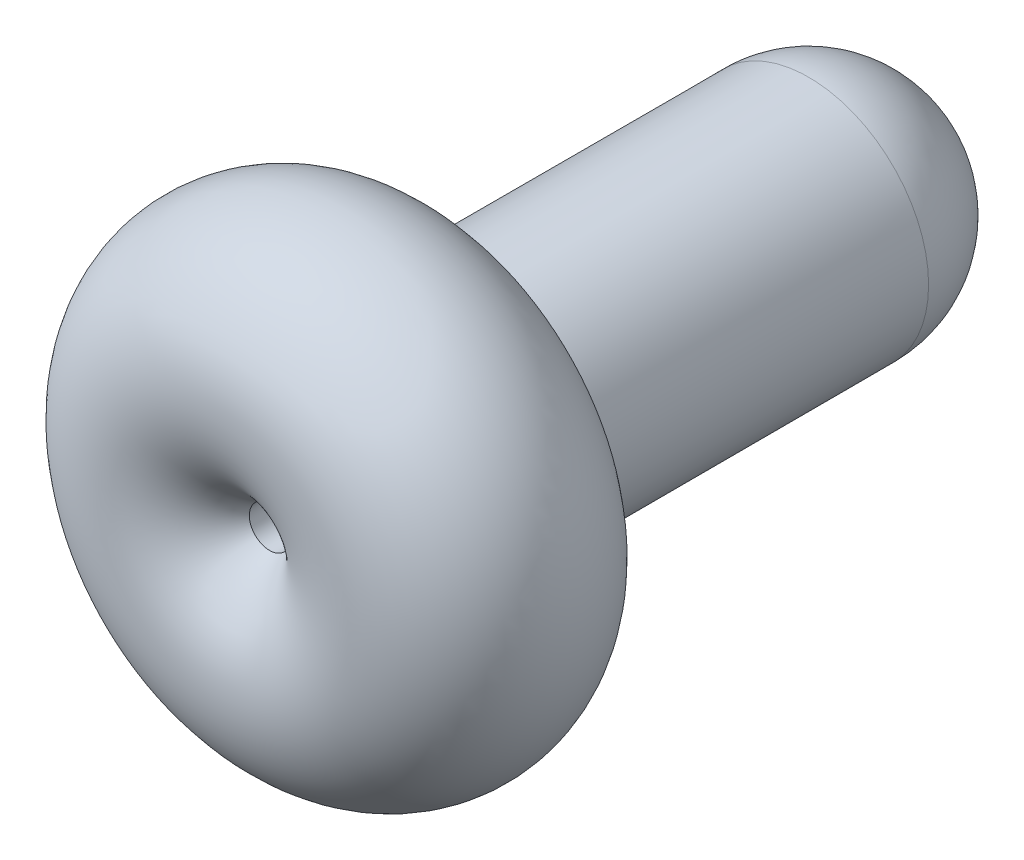
ISO-10303-21;
HEADER;
FILE_DESCRIPTION(('STEP AP214'),'2;1');
FILE_NAME('part.step','',(''),(''),'','','');
FILE_SCHEMA(('AUTOMOTIVE_DESIGN { 1 0 10303 214 1 1 1 1 }'));
ENDSEC;
DATA;
#1=APPLICATION_CONTEXT('core data for automotive mechanical design processes');
#2=APPLICATION_PROTOCOL_DEFINITION('international standard','automotive_design',2000,#1);
#3=PRODUCT_CONTEXT('',#1,'mechanical');
#4=PRODUCT('Part','Part','',(#3));
#5=PRODUCT_RELATED_PRODUCT_CATEGORY('part','',(#4));
#6=PRODUCT_DEFINITION_FORMATION('','',#4);
#7=PRODUCT_DEFINITION_CONTEXT('part definition',#1,'design');
#8=PRODUCT_DEFINITION('design','',#6,#7);
#9=PRODUCT_DEFINITION_SHAPE('','',#8);
#10=(LENGTH_UNIT() NAMED_UNIT(*) SI_UNIT(.MILLI.,.METRE.));
#11=(NAMED_UNIT(*) PLANE_ANGLE_UNIT() SI_UNIT($,.RADIAN.));
#12=(NAMED_UNIT(*) SI_UNIT($,.STERADIAN.) SOLID_ANGLE_UNIT());
#13=UNCERTAINTY_MEASURE_WITH_UNIT(LENGTH_MEASURE(1.E-05),#10,'distance_accuracy_value','');
#14=(GEOMETRIC_REPRESENTATION_CONTEXT(3) GLOBAL_UNCERTAINTY_ASSIGNED_CONTEXT((#13)) GLOBAL_UNIT_ASSIGNED_CONTEXT((#10,
#11,#12)) REPRESENTATION_CONTEXT('',''));
#15=CARTESIAN_POINT('',(0.,0.,0.));
#16=DIRECTION('',(0.,0.,1.));
#17=DIRECTION('',(1.,0.,0.));
#18=AXIS2_PLACEMENT_3D('',#15,#16,#17);
#19=CARTESIAN_POINT('',(-2.14820546420857E-05,0.,-0.0252715767265323));
#20=DIRECTION('',(0.000850047747802191,0.,0.999999638709348));
#21=DIRECTION('',(0.999999638709348,0.,-0.000850047747802191));
#22=AXIS2_PLACEMENT_3D('',#19,#20,#21);
#23=DEGENERATE_TOROIDAL_SURFACE('',#22,29.7295967101522,29.7296074511815,.T.);
#24=CARTESIAN_POINT('',(-0.0252930587811734,0.,-29.7548575458534));
#25=DIRECTION('',(0.000850047747802191,0.,0.999999638709348));
#26=DIRECTION('',(0.999999638709348,0.,-0.000850047747802191));
#27=AXIS2_PLACEMENT_3D('',#24,#25,#26);
#28=CIRCLE('',#27,29.7043251242953);
#29=CARTESIAN_POINT('',(29.6790213336192,0.,-29.7801076405253));
#30=VERTEX_POINT('',#29);
#31=EDGE_CURVE('E11',#30,#30,#28,.T.);
#32=ORIENTED_EDGE('',*,*,#31,.T.);
#33=EDGE_LOOP('',(#32));
#34=FACE_BOUND('',#33,.T.);
#35=CARTESIAN_POINT('',(-3.52937908554141,-3.54167803054972,16.4939822803967));
#36=CARTESIAN_POINT('',(-3.43265624655147,-3.6380668936276,16.4934945608445));
#37=CARTESIAN_POINT('',(-3.33199660969603,-3.73047539620615,16.4929869685404));
#38=CARTESIAN_POINT('',(-3.12342158537705,-3.90677384189353,16.4919351446487));
#39=CARTESIAN_POINT('',(-3.01550453639253,-3.99066182319261,16.4913909046708));
#40=CARTESIAN_POINT('',(-2.79307977069744,-4.14938414489942,16.4902691263667));
#41=CARTESIAN_POINT('',(-2.67856688402947,-4.22421123667159,16.4896915619195));
#42=CARTESIAN_POINT('',(-2.44375426265563,-4.36425929494615,16.4885071819435));
#43=CARTESIAN_POINT('',(-2.32345243820394,-4.42947675743579,16.4879003558515));
#44=CARTESIAN_POINT('',(-2.07447267051277,-4.55151813816418,16.4866443803725));
#45=CARTESIAN_POINT('',(-1.94565457157575,-4.6080563389957,16.4859945219852));
#46=CARTESIAN_POINT('',(-1.68366509587379,-4.71010006421125,16.4846727633293));
#47=CARTESIAN_POINT('',(-1.55049208721205,-4.75560139776745,16.4840008547976));
#48=CARTESIAN_POINT('',(-1.28085436381916,-4.83520030383926,16.4826403444658));
#49=CARTESIAN_POINT('',(-1.14439136414236,-4.86930368589197,16.4819517513625));
#50=CARTESIAN_POINT('',(-0.869027147389787,-4.9259066691826,16.480562173495));
#51=CARTESIAN_POINT('',(-0.730125047777996,-4.94840197694336,16.479861184245));
#52=CARTESIAN_POINT('',(-0.45096142258437,-4.98160480811783,16.4784522544444));
#53=CARTESIAN_POINT('',(-0.310700317770138,-4.99231586942173,16.4777443160445));
#54=CARTESIAN_POINT('',(-0.0297225784775018,-5.00188806359017,16.476326048908));
#55=CARTESIAN_POINT('',(0.110994205085493,-5.00074481926538,16.4756157193852));
#56=CARTESIAN_POINT('',(0.391782313508285,-4.98660797191695,16.4741982269725));
#57=CARTESIAN_POINT('',(0.531853847610922,-4.97361852901479,16.4734910630585));
#58=CARTESIAN_POINT('',(0.810454311570726,-4.93588240751348,16.4720844342613));
#59=CARTESIAN_POINT('',(0.9489826527859,-4.91113138977399,16.4713849723171));
#60=CARTESIAN_POINT('',(1.22341838095097,-4.85005059600272,16.469999195708));
#61=CARTESIAN_POINT('',(1.35932673169215,-4.81372516739331,16.4693128762091));
#62=CARTESIAN_POINT('',(1.6276181288711,-4.72976268692778,16.4679579576815));
#63=CARTESIAN_POINT('',(1.75999985523383,-4.68212146374938,16.4672893652886));
#64=CARTESIAN_POINT('',(2.15031988340826,-4.52271052953501,16.4653179419673));
#65=CARTESIAN_POINT('',(2.40173110409843,-4.39438692988881,16.4640479597478));
#66=CARTESIAN_POINT('',(2.87929972232492,-4.09741578857534,16.4616353113406));
#67=CARTESIAN_POINT('',(3.1054572330219,-3.92876842760752,16.4604926445824));
#68=CARTESIAN_POINT('',(3.52628607759998,-3.55588124102709,16.4583662044062));
#69=CARTESIAN_POINT('',(3.72095746455414,-3.35164147541028,16.4573824307204));
#70=CARTESIAN_POINT('',(4.07323603505961,-2.91338427794481,16.455602058692));
#71=CARTESIAN_POINT('',(4.23084361080811,-2.67936716123078,16.4548054583688));
#72=CARTESIAN_POINT('',(4.50453639709806,-2.1881924036297,16.4534220508267));
#73=CARTESIAN_POINT('',(4.62062157824366,-1.93103474636042,16.4528352437562));
#74=CARTESIAN_POINT('',(4.80796901307307,-1.40088353914708,16.4518881774763));
#75=CARTESIAN_POINT('',(4.87923182620671,-1.12789018690249,16.4515279154392));
#76=CARTESIAN_POINT('',(4.97491465119113,-0.573814018295399,16.451044194652));
#77=CARTESIAN_POINT('',(4.99933467849509,-0.292731204601601,16.4509207358239));
#78=CARTESIAN_POINT('',(5.0006384353805,0.269542376089051,16.4509141445856));
#79=CARTESIAN_POINT('',(4.97752254435202,0.550733142206416,16.4510310102574));
#80=CARTESIAN_POINT('',(4.88441154231587,1.1052427242294,16.4515017298513));
#81=CARTESIAN_POINT('',(4.81441642800171,1.3785615395798,16.4518555837901));
#82=CARTESIAN_POINT('',(4.6295340908725,1.90956841482521,16.4527901908606));
#83=CARTESIAN_POINT('',(4.51464688572011,2.16725648087004,16.4533709439031));
#84=CARTESIAN_POINT('',(4.24324186183084,2.65968713652602,16.4547427924158));
#85=CARTESIAN_POINT('',(4.08672404310146,2.8944297261413,16.455533887886));
#86=CARTESIAN_POINT('',(3.73649969384899,3.33430773514405,16.4573038859838));
#87=CARTESIAN_POINT('',(3.54279288436246,3.5394429324192,16.4582827900203));
#88=CARTESIAN_POINT('',(3.12369018355613,3.91428120422248,16.4604005191516));
#89=CARTESIAN_POINT('',(2.89829428903823,4.08398427517473,16.4615393442626));
#90=CARTESIAN_POINT('',(2.42220884623318,4.3831431236294,16.4639445144287));
#91=CARTESIAN_POINT('',(2.17151899160345,4.51259841360161,16.4652108610283));
#92=CARTESIAN_POINT('',(1.65196421269304,4.72758427866496,16.4678350384164));
#93=CARTESIAN_POINT('',(1.38309928935721,4.81311485603957,16.4691928692003));
#94=CARTESIAN_POINT('',(0.834823561043546,4.93782449510462,16.4719614333928));
#95=CARTESIAN_POINT('',(0.555412637921729,4.97700303736658,16.4733721673941));
#96=CARTESIAN_POINT('',(-0.0060214141050611,5.007894021852,16.4762064546336));
#97=CARTESIAN_POINT('',(-0.288044544088954,4.99960644446967,16.4776300078772));
#98=CARTESIAN_POINT('',(-0.84669647806471,4.93580309981764,16.4804495260134));
#99=CARTESIAN_POINT('',(-1.12332525010208,4.88028705286809,16.4818454907426));
#100=CARTESIAN_POINT('',(-1.66334261361597,4.72359144580923,16.484570273517));
#101=CARTESIAN_POINT('',(-1.926731217943,4.62241193002044,16.4858990916273));
#102=CARTESIAN_POINT('',(-2.43275778555927,4.37730226700009,16.4884517534184));
#103=CARTESIAN_POINT('',(-2.67539580868987,4.23337224305952,16.4896755974018));
#104=CARTESIAN_POINT('',(-3.13315780860542,3.9066956236493,16.4919842769673));
#105=CARTESIAN_POINT('',(-3.34828174083506,3.7239489653227,16.4930691123243));
#106=CARTESIAN_POINT('',(-3.64551141398776,3.42492439332556,16.4945678683024));
#107=CARTESIAN_POINT('',(-3.74038885878674,3.32103700360415,16.4950462572094));
#108=CARTESIAN_POINT('',(-3.92105066228133,3.10565300686295,16.4959571504188));
#109=CARTESIAN_POINT('',(-4.00683836417956,2.99415922244776,16.4963896715913));
#110=CARTESIAN_POINT('',(-4.16873993933254,2.76430579991862,16.4972059119305));
#111=CARTESIAN_POINT('',(-4.24485021225212,2.6459436302417,16.4975896129343));
#112=CARTESIAN_POINT('',(-4.3868031066236,2.40327026778256,16.4983052303677));
#113=CARTESIAN_POINT('',(-4.45264950727546,2.27896128677896,16.4986371658574));
#114=CARTESIAN_POINT('',(-4.57366015769042,2.02519180479443,16.4992471719118));
#115=CARTESIAN_POINT('',(-4.62882040498249,1.89572939541139,16.4995252222939));
#116=CARTESIAN_POINT('',(-4.72801819429053,1.63266562641776,16.500025246259));
#117=CARTESIAN_POINT('',(-4.77205983418588,1.49906581213238,16.5002472405021));
#118=CARTESIAN_POINT('',(-4.84874650555702,1.22858617729012,16.5006337774642));
#119=CARTESIAN_POINT('',(-4.88138773292308,1.09170527814541,16.5007983010064));
#120=CARTESIAN_POINT('',(-4.93501115082378,0.815730948275033,16.5010685800084));
#121=CARTESIAN_POINT('',(-4.95599764052373,0.676638352894748,16.5011743571386));
#122=CARTESIAN_POINT('',(-4.9861849113398,0.397142866337847,16.5013265077917));
#123=CARTESIAN_POINT('',(-4.9953825848703,0.256739639493487,16.5013728656515));
#124=CARTESIAN_POINT('',(-5.0019154223811,-0.024290598061804,16.5014057923516));
#125=CARTESIAN_POINT('',(-4.99925496170459,-0.164917507097559,16.5013923832443));
#126=CARTESIAN_POINT('',(-4.98209525174279,-0.445531445270577,16.5013058949699));
#127=CARTESIAN_POINT('',(-4.96758894432489,-0.585518042870909,16.5012327802282));
#128=CARTESIAN_POINT('',(-4.92683931662349,-0.863719477874172,16.5010273915224));
#129=CARTESIAN_POINT('',(-4.90060032357629,-1.00193494918681,16.5008951393692));
#130=CARTESIAN_POINT('',(-4.83654714593039,-1.27577424411664,16.5005722866788));
#131=CARTESIAN_POINT('',(-4.79872370799512,-1.41139590352458,16.5003816394971));
#132=CARTESIAN_POINT('',(-4.7117945407551,-1.67891842388791,16.4999434690349));
#133=CARTESIAN_POINT('',(-4.66269291883245,-1.81082061984075,16.4996959664603));
#134=CARTESIAN_POINT('',(-4.5535904523955,-2.06991653145777,16.4991460046495));
#135=CARTESIAN_POINT('',(-4.49359833847934,-2.19711392121057,16.4988435894352));
#136=CARTESIAN_POINT('',(-4.36313943666772,-2.44596651967509,16.4981859374553));
#137=CARTESIAN_POINT('',(-4.29267520795588,-2.56762307299736,16.4978307135951));
#138=CARTESIAN_POINT('',(-4.11872069416306,-2.84072654333449,16.4969537424178));
#139=CARTESIAN_POINT('',(-4.01171103415531,-2.98994850281468,16.4964142432811));
#140=CARTESIAN_POINT('',(-3.78195785073142,-3.27572985734785,16.4952558557724));
#141=CARTESIAN_POINT('',(-3.65921535302553,-3.41229007688997,16.4946369725759));
#142=CARTESIAN_POINT('',(-3.52937908554141,-3.54167803054972,16.4939822803967));
#143=B_SPLINE_CURVE_WITH_KNOTS('',3,(#35,#36,#37,#38,#39,#40,#41,#42,#43,#44,#45,#46,#47,#48,
#49,#50,#51,#52,#53,#54,#55,#56,#57,#58,#59,#60,#61,#62,#63,#64,#65,#66,#67,#68,#69,#70,#71,#72,
#73,#74,#75,#76,#77,#78,#79,#80,#81,#82,#83,#84,#85,#86,#87,#88,#89,#90,#91,#92,#93,#94,#95,#96,
#97,#98,#99,#100,#101,#102,#103,#104,#105,#106,#107,#108,#109,#110,#111,#112,#113,#114,#115,
#116,#117,#118,#119,#120,#121,#122,#123,#124,#125,#126,#127,#128,#129,#130,#131,#132,#133,#134,
#135,#136,#137,#138,#139,#140,#141,#142),.UNSPECIFIED.,.T.,.F.,(4,2,2,2,2,2,2,2,2,2,2,2,2,2,2,2,
2,2,2,2,2,2,2,2,2,2,2,2,2,2,2,2,2,2,2,2,2,2,2,2,2,2,2,2,2,2,2,2,2,2,2,2,2,4),(0.,
0.409504181570481,0.819102436821026,1.22902623225574,1.6390991325489,2.0606393536247,
2.48233938877044,2.90382415439579,3.32546470300546,3.74697863126907,4.16864820862913,
4.59016976200887,5.01184694615173,5.43336593199786,5.85504054349197,6.69748503071416,
7.53992574283215,8.38236503491604,9.22479541217998,10.0672263858427,10.9096468445052,
11.7520670252578,12.5944804825761,13.4368939993116,14.2793071846025,15.1217203697417,
15.9641398742692,16.8065594638154,17.6489892573775,18.4914190071448,19.333858197228,
20.1762977352791,21.0187422621644,21.8611859713831,22.703627251047,23.5460698949122,
23.967739107321,24.3892526876911,24.8109226295503,25.2324369421738,25.6541088279455,
26.0756250744862,26.4972818392333,26.9187829609842,27.3403951695139,27.7618518269817,
28.1835597851298,28.6051123375343,29.0270024966266,29.4487392512153,29.8701393926266,
30.2914367207693,30.8411720244532,31.3908715060801),.UNSPECIFIED.);
#144=CARTESIAN_POINT('',(-3.52937908554141,-3.54167803054972,16.4939822803967));
#145=VERTEX_POINT('',#144);
#146=EDGE_CURVE('E43',#145,#145,#143,.T.);
#147=ORIENTED_EDGE('',*,*,#146,.F.);
#148=EDGE_LOOP('',(#147));
#149=FACE_BOUND('',#148,.T.);
#150=ADVANCED_FACE('F39',(#34,#149),#23,.T.);
#151=CARTESIAN_POINT('',(-0.0740599871520978,0.,-116.729686838683));
#152=DIRECTION('',(0.,-1.,0.));
#153=DIRECTION('',(0.999999638709348,0.,-0.000850047747802191));
#154=AXIS2_PLACEMENT_3D('',#151,#152,#153);
#155=CIRCLE('',#154,29.6052157882059);
#156=TRIMMED_CURVE('',#155,(PARAMETER_VALUE(-1.57164637464507)),
(PARAMETER_VALUE(1.57164637464507)),.T.,.PARAMETER.);
#157=CARTESIAN_POINT('',(-0.099225825063873,0.,-116.729665446511));
#158=DIRECTION('',(0.000850047747802191,0.,0.999999638709348));
#159=AXIS1_PLACEMENT('',#157,#158);
#160=SURFACE_OF_REVOLUTION('',#156,#159);
#161=CARTESIAN_POINT('',(-0.0992472172354402,0.,-116.754831284423));
#162=DIRECTION('',(0.000850047747802191,0.,0.999999638709348));
#163=DIRECTION('',(0.999999638709348,0.,-0.000850047747802191));
#164=AXIS2_PLACEMENT_3D('',#161,#162,#163);
#165=CIRCLE('',#164,29.6303709391221);
#166=CARTESIAN_POINT('',(29.5311130167106,0.,-116.780018514506));
#167=VERTEX_POINT('',#166);
#168=EDGE_CURVE('E52',#167,#167,#165,.T.);
#169=ORIENTED_EDGE('',*,*,#168,.F.);
#170=EDGE_LOOP('',(#169));
#171=FACE_BOUND('',#170,.T.);
#172=CARTESIAN_POINT('',(-0.12439166297565,0.,-146.334859842545));
#173=VERTEX_POINT('',#172);
#174=VERTEX_LOOP('',#173);
#175=FACE_BOUND('',#174,.T.);
#176=ADVANCED_FACE('F41',(#171,#175),#160,.T.);
#177=CARTESIAN_POINT('',(-0.0992472172354402,0.,-116.754831284423));
#178=DIRECTION('',(0.000850047747802191,0.,0.999999638709348));
#179=DIRECTION('',(0.999999638709348,0.,-0.000850047747802191));
#180=AXIS2_PLACEMENT_3D('',#177,#178,#179);
#181=CONICAL_SURFACE('',#180,29.6303709391221,0.000850047850173629);
#182=ORIENTED_EDGE('',*,*,#31,.F.);
#183=EDGE_LOOP('',(#182));
#184=FACE_BOUND('',#183,.T.);
#185=ORIENTED_EDGE('',*,*,#168,.T.);
#186=EDGE_LOOP('',(#185));
#187=FACE_BOUND('',#186,.T.);
#188=ADVANCED_FACE('F56',(#184,#187),#181,.T.);
#189=CARTESIAN_POINT('',(0.,0.,50.));
#190=DIRECTION('',(0.,0.,-1.));
#191=DIRECTION('',(-1.,0.,0.));
#192=AXIS2_PLACEMENT_3D('',#189,#190,#191);
#193=CYLINDRICAL_SURFACE('',#192,5.);
#194=CARTESIAN_POINT('',(0.,0.,-50.));
#195=DIRECTION('',(0.,0.,1.));
#196=DIRECTION('',(1.,0.,0.));
#197=AXIS2_PLACEMENT_3D('',#194,#195,#196);
#198=CIRCLE('',#197,5.);
#199=CARTESIAN_POINT('',(5.,0.,-50.));
#200=VERTEX_POINT('',#199);
#201=EDGE_CURVE('E73',#200,#200,#198,.T.);
#202=ORIENTED_EDGE('',*,*,#201,.F.);
#203=EDGE_LOOP('',(#202));
#204=FACE_BOUND('',#203,.T.);
#205=ORIENTED_EDGE('',*,*,#146,.T.);
#206=EDGE_LOOP('',(#205));
#207=FACE_BOUND('',#206,.T.);
#208=ADVANCED_FACE('F62',(#204,#207),#193,.F.);
#209=CARTESIAN_POINT('',(0.,0.,-50.));
#210=DIRECTION('',(0.,0.,1.));
#211=DIRECTION('',(1.,0.,0.));
#212=AXIS2_PLACEMENT_3D('',#209,#210,#211);
#213=PLANE('',#212);
#214=ORIENTED_EDGE('',*,*,#201,.T.);
#215=EDGE_LOOP('',(#214));
#216=FACE_BOUND('',#215,.T.);
#217=ADVANCED_FACE('F79',(#216),#213,.T.);
#218=CLOSED_SHELL('',(#150,#176,#188,#208,#217));
#219=MANIFOLD_SOLID_BREP('B2',#218);
#220=ADVANCED_BREP_SHAPE_REPRESENTATION('',(#18,#219),#14);
#221=SHAPE_DEFINITION_REPRESENTATION(#9,#220);
ENDSEC;
END-ISO-10303-21;
